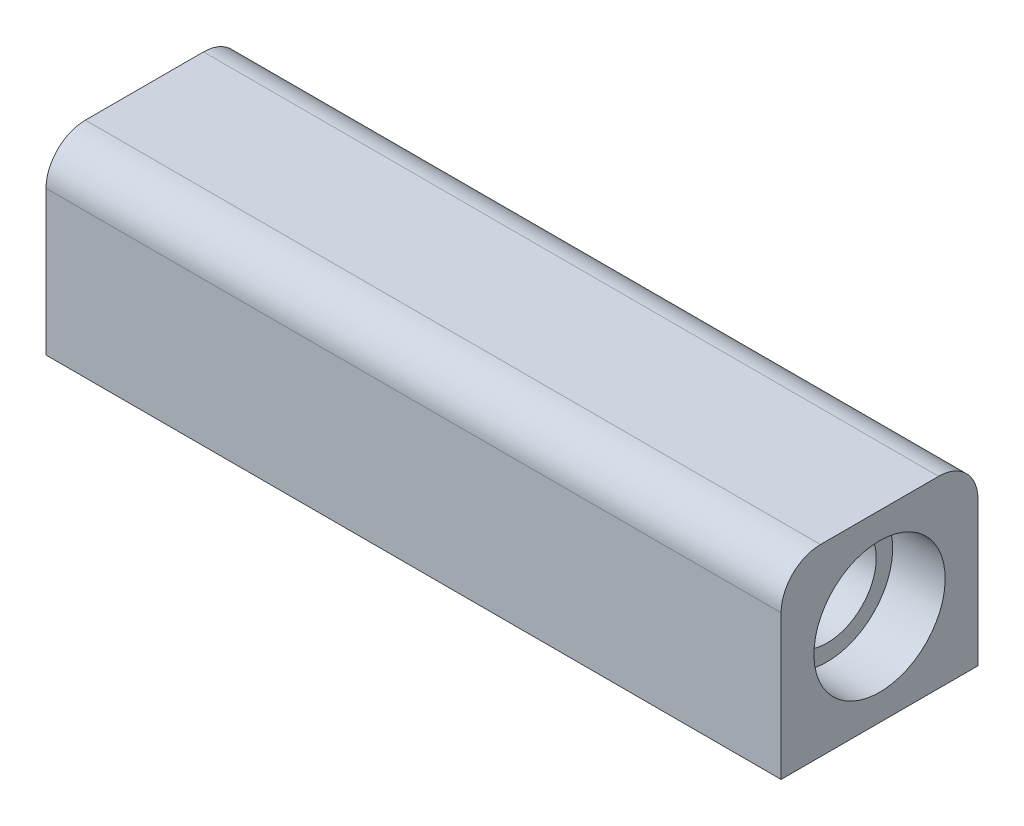
ISO-10303-21;
HEADER;
FILE_DESCRIPTION(('STEP AP214'),'2;1');
FILE_NAME('part.step','',(''),(''),'','','');
FILE_SCHEMA(('AUTOMOTIVE_DESIGN { 1 0 10303 214 1 1 1 1 }'));
ENDSEC;
DATA;
#1=APPLICATION_CONTEXT('core data for automotive mechanical design processes');
#2=APPLICATION_PROTOCOL_DEFINITION('international standard','automotive_design',2000,#1);
#3=PRODUCT_CONTEXT('',#1,'mechanical');
#4=PRODUCT('Part','Part','',(#3));
#5=PRODUCT_RELATED_PRODUCT_CATEGORY('part','',(#4));
#6=PRODUCT_DEFINITION_FORMATION('','',#4);
#7=PRODUCT_DEFINITION_CONTEXT('part definition',#1,'design');
#8=PRODUCT_DEFINITION('design','',#6,#7);
#9=PRODUCT_DEFINITION_SHAPE('','',#8);
#10=(LENGTH_UNIT() NAMED_UNIT(*) SI_UNIT(.MILLI.,.METRE.));
#11=(NAMED_UNIT(*) PLANE_ANGLE_UNIT() SI_UNIT($,.RADIAN.));
#12=(NAMED_UNIT(*) SI_UNIT($,.STERADIAN.) SOLID_ANGLE_UNIT());
#13=UNCERTAINTY_MEASURE_WITH_UNIT(LENGTH_MEASURE(1.E-05),#10,'distance_accuracy_value','');
#14=(GEOMETRIC_REPRESENTATION_CONTEXT(3) GLOBAL_UNCERTAINTY_ASSIGNED_CONTEXT((#13)) GLOBAL_UNIT_ASSIGNED_CONTEXT((#10,
#11,#12)) REPRESENTATION_CONTEXT('',''));
#15=CARTESIAN_POINT('',(0.,0.,0.));
#16=DIRECTION('',(0.,0.,1.));
#17=DIRECTION('',(1.,0.,0.));
#18=AXIS2_PLACEMENT_3D('',#15,#16,#17);
#19=CARTESIAN_POINT('',(28.,0.,7.5));
#20=DIRECTION('',(1.,0.,0.));
#21=DIRECTION('',(0.,0.,-1.));
#22=AXIS2_PLACEMENT_3D('',#19,#20,#21);
#23=CYLINDRICAL_SURFACE('',#22,3.74999999999999);
#24=CARTESIAN_POINT('',(24.,0.,7.5));
#25=DIRECTION('',(1.,0.,0.));
#26=DIRECTION('',(0.,1.,0.));
#27=AXIS2_PLACEMENT_3D('',#24,#25,#26);
#28=CIRCLE('',#27,3.74999999999999);
#29=CARTESIAN_POINT('',(24.,3.74999999999997,7.5));
#30=VERTEX_POINT('',#29);
#31=EDGE_CURVE('E125',#30,#30,#28,.F.);
#32=ORIENTED_EDGE('',*,*,#31,.F.);
#33=EDGE_LOOP('',(#32));
#34=FACE_BOUND('',#33,.T.);
#35=CARTESIAN_POINT('',(-24.,0.,7.5));
#36=DIRECTION('',(-1.,0.,0.));
#37=DIRECTION('',(0.,0.,1.));
#38=AXIS2_PLACEMENT_3D('',#35,#36,#37);
#39=CIRCLE('',#38,3.74999999999999);
#40=CARTESIAN_POINT('',(-24.,0.,11.25));
#41=VERTEX_POINT('',#40);
#42=EDGE_CURVE('E129',#41,#41,#39,.F.);
#43=ORIENTED_EDGE('',*,*,#42,.F.);
#44=EDGE_LOOP('',(#43));
#45=FACE_BOUND('',#44,.T.);
#46=ADVANCED_FACE('F39',(#34,#45),#23,.F.);
#47=CARTESIAN_POINT('',(-28.,7.,15.));
#48=DIRECTION('',(1.,0.,0.));
#49=DIRECTION('',(0.,1.,0.));
#50=AXIS2_PLACEMENT_3D('',#47,#48,#49);
#51=PLANE('',#50);
#52=CARTESIAN_POINT('',(-28.,0.,7.5));
#53=DIRECTION('',(-1.,0.,0.));
#54=DIRECTION('',(0.,0.,1.));
#55=AXIS2_PLACEMENT_3D('',#52,#53,#54);
#56=CIRCLE('',#55,5.);
#57=CARTESIAN_POINT('',(-28.,0.,12.5));
#58=VERTEX_POINT('',#57);
#59=EDGE_CURVE('E280',#58,#58,#56,.T.);
#60=ORIENTED_EDGE('',*,*,#59,.F.);
#61=EDGE_LOOP('',(#60));
#62=FACE_BOUND('',#61,.T.);
#63=DIRECTION('',(0.,0.,-1.));
#64=VECTOR('',#63,1.);
#65=CARTESIAN_POINT('',(-28.,7.,15.));
#66=LINE('',#65,#64);
#67=CARTESIAN_POINT('',(-28.,7.,12.));
#68=VERTEX_POINT('',#67);
#69=CARTESIAN_POINT('',(-28.,7.,3.));
#70=VERTEX_POINT('',#69);
#71=EDGE_CURVE('E150',#68,#70,#66,.T.);
#72=ORIENTED_EDGE('',*,*,#71,.T.);
#73=CARTESIAN_POINT('',(-28.,4.,3.));
#74=DIRECTION('',(1.,0.,0.));
#75=DIRECTION('',(0.,1.,0.));
#76=AXIS2_PLACEMENT_3D('',#73,#74,#75);
#77=CIRCLE('',#76,3.);
#78=CARTESIAN_POINT('',(-28.,4.,0.));
#79=VERTEX_POINT('',#78);
#80=EDGE_CURVE('E138',#70,#79,#77,.F.);
#81=ORIENTED_EDGE('',*,*,#80,.T.);
#82=DIRECTION('',(0.,-1.,0.));
#83=VECTOR('',#82,1.);
#84=CARTESIAN_POINT('',(-28.,7.,0.));
#85=LINE('',#84,#83);
#86=CARTESIAN_POINT('',(-28.,-7.,0.));
#87=VERTEX_POINT('',#86);
#88=EDGE_CURVE('E115',#79,#87,#85,.T.);
#89=ORIENTED_EDGE('',*,*,#88,.T.);
#90=DIRECTION('',(0.,0.,-1.));
#91=VECTOR('',#90,1.);
#92=CARTESIAN_POINT('',(-28.,-7.,15.));
#93=LINE('',#92,#91);
#94=CARTESIAN_POINT('',(-28.,-7.,15.));
#95=VERTEX_POINT('',#94);
#96=EDGE_CURVE('E108',#95,#87,#93,.T.);
#97=ORIENTED_EDGE('',*,*,#96,.F.);
#98=DIRECTION('',(0.,-1.,0.));
#99=VECTOR('',#98,1.);
#100=CARTESIAN_POINT('',(-28.,7.,15.));
#101=LINE('',#100,#99);
#102=CARTESIAN_POINT('',(-28.,4.,15.));
#103=VERTEX_POINT('',#102);
#104=EDGE_CURVE('E95',#103,#95,#101,.T.);
#105=ORIENTED_EDGE('',*,*,#104,.F.);
#106=CARTESIAN_POINT('',(-28.,4.,12.));
#107=DIRECTION('',(1.,0.,0.));
#108=DIRECTION('',(0.,1.,0.));
#109=AXIS2_PLACEMENT_3D('',#106,#107,#108);
#110=CIRCLE('',#109,3.);
#111=EDGE_CURVE('E136',#103,#68,#110,.F.);
#112=ORIENTED_EDGE('',*,*,#111,.T.);
#113=EDGE_LOOP('',(#72,#81,#89,#97,#105,#112));
#114=FACE_BOUND('',#113,.T.);
#115=ADVANCED_FACE('F114',(#62,#114),#51,.F.);
#116=CARTESIAN_POINT('',(28.,-7.,15.));
#117=DIRECTION('',(0.,1.,0.));
#118=DIRECTION('',(-1.,0.,0.));
#119=AXIS2_PLACEMENT_3D('',#116,#117,#118);
#120=PLANE('',#119);
#121=DIRECTION('',(1.,0.,0.));
#122=VECTOR('',#121,1.);
#123=CARTESIAN_POINT('',(28.,-7.,0.));
#124=LINE('',#123,#122);
#125=CARTESIAN_POINT('',(28.,-7.,0.));
#126=VERTEX_POINT('',#125);
#127=EDGE_CURVE('E153',#87,#126,#124,.T.);
#128=ORIENTED_EDGE('',*,*,#127,.T.);
#129=DIRECTION('',(0.,0.,-1.));
#130=VECTOR('',#129,1.);
#131=CARTESIAN_POINT('',(28.,-7.,15.));
#132=LINE('',#131,#130);
#133=CARTESIAN_POINT('',(28.,-7.,15.));
#134=VERTEX_POINT('',#133);
#135=EDGE_CURVE('E110',#134,#126,#132,.T.);
#136=ORIENTED_EDGE('',*,*,#135,.F.);
#137=DIRECTION('',(1.,0.,0.));
#138=VECTOR('',#137,1.);
#139=CARTESIAN_POINT('',(28.,-7.,15.));
#140=LINE('',#139,#138);
#141=EDGE_CURVE('E98',#95,#134,#140,.T.);
#142=ORIENTED_EDGE('',*,*,#141,.F.);
#143=ORIENTED_EDGE('',*,*,#96,.T.);
#144=EDGE_LOOP('',(#128,#136,#142,#143));
#145=FACE_BOUND('',#144,.T.);
#146=ADVANCED_FACE('F107',(#145),#120,.F.);
#147=CARTESIAN_POINT('',(28.,7.,15.));
#148=DIRECTION('',(-1.,0.,0.));
#149=DIRECTION('',(0.,-1.,0.));
#150=AXIS2_PLACEMENT_3D('',#147,#148,#149);
#151=PLANE('',#150);
#152=CARTESIAN_POINT('',(28.,0.,7.5));
#153=DIRECTION('',(1.,0.,0.));
#154=DIRECTION('',(0.,1.,0.));
#155=AXIS2_PLACEMENT_3D('',#152,#153,#154);
#156=CIRCLE('',#155,5.);
#157=CARTESIAN_POINT('',(28.,4.99999999999998,7.5));
#158=VERTEX_POINT('',#157);
#159=EDGE_CURVE('E131',#158,#158,#156,.T.);
#160=ORIENTED_EDGE('',*,*,#159,.F.);
#161=EDGE_LOOP('',(#160));
#162=FACE_BOUND('',#161,.T.);
#163=DIRECTION('',(0.,1.,0.));
#164=VECTOR('',#163,1.);
#165=CARTESIAN_POINT('',(28.,7.,0.));
#166=LINE('',#165,#164);
#167=CARTESIAN_POINT('',(28.,4.,0.));
#168=VERTEX_POINT('',#167);
#169=EDGE_CURVE('E103',#126,#168,#166,.T.);
#170=ORIENTED_EDGE('',*,*,#169,.T.);
#171=CARTESIAN_POINT('',(28.,4.,3.));
#172=DIRECTION('',(-1.,0.,0.));
#173=DIRECTION('',(0.,-1.,0.));
#174=AXIS2_PLACEMENT_3D('',#171,#172,#173);
#175=CIRCLE('',#174,3.);
#176=CARTESIAN_POINT('',(28.,7.,3.));
#177=VERTEX_POINT('',#176);
#178=EDGE_CURVE('E47',#168,#177,#175,.F.);
#179=ORIENTED_EDGE('',*,*,#178,.T.);
#180=DIRECTION('',(0.,0.,-1.));
#181=VECTOR('',#180,1.);
#182=CARTESIAN_POINT('',(28.,7.,15.));
#183=LINE('',#182,#181);
#184=CARTESIAN_POINT('',(28.,7.,12.));
#185=VERTEX_POINT('',#184);
#186=EDGE_CURVE('E121',#185,#177,#183,.T.);
#187=ORIENTED_EDGE('',*,*,#186,.F.);
#188=CARTESIAN_POINT('',(28.,4.,12.));
#189=DIRECTION('',(-1.,0.,0.));
#190=DIRECTION('',(0.,-1.,0.));
#191=AXIS2_PLACEMENT_3D('',#188,#189,#190);
#192=CIRCLE('',#191,3.);
#193=CARTESIAN_POINT('',(28.,4.,15.));
#194=VERTEX_POINT('',#193);
#195=EDGE_CURVE('E54',#185,#194,#192,.F.);
#196=ORIENTED_EDGE('',*,*,#195,.T.);
#197=DIRECTION('',(0.,1.,0.));
#198=VECTOR('',#197,1.);
#199=CARTESIAN_POINT('',(28.,7.,15.));
#200=LINE('',#199,#198);
#201=EDGE_CURVE('E111',#134,#194,#200,.T.);
#202=ORIENTED_EDGE('',*,*,#201,.F.);
#203=ORIENTED_EDGE('',*,*,#135,.T.);
#204=EDGE_LOOP('',(#170,#179,#187,#196,#202,#203));
#205=FACE_BOUND('',#204,.T.);
#206=ADVANCED_FACE('F143',(#162,#205),#151,.F.);
#207=CARTESIAN_POINT('',(28.,7.,15.));
#208=DIRECTION('',(0.,-1.,0.));
#209=DIRECTION('',(1.,0.,0.));
#210=AXIS2_PLACEMENT_3D('',#207,#208,#209);
#211=PLANE('',#210);
#212=ORIENTED_EDGE('',*,*,#186,.T.);
#213=DIRECTION('',(-1.,0.,0.));
#214=VECTOR('',#213,1.);
#215=CARTESIAN_POINT('',(-28.,7.,3.));
#216=LINE('',#215,#214);
#217=EDGE_CURVE('E119',#177,#70,#216,.T.);
#218=ORIENTED_EDGE('',*,*,#217,.T.);
#219=ORIENTED_EDGE('',*,*,#71,.F.);
#220=DIRECTION('',(-1.,0.,0.));
#221=VECTOR('',#220,1.);
#222=CARTESIAN_POINT('',(28.,7.,12.));
#223=LINE('',#222,#221);
#224=EDGE_CURVE('E117',#68,#185,#223,.F.);
#225=ORIENTED_EDGE('',*,*,#224,.T.);
#226=EDGE_LOOP('',(#212,#218,#219,#225));
#227=FACE_BOUND('',#226,.T.);
#228=ADVANCED_FACE('F147',(#227),#211,.F.);
#229=CARTESIAN_POINT('',(0.,0.,15.));
#230=DIRECTION('',(0.,0.,-1.));
#231=DIRECTION('',(-1.,0.,0.));
#232=AXIS2_PLACEMENT_3D('',#229,#230,#231);
#233=PLANE('',#232);
#234=ORIENTED_EDGE('',*,*,#201,.T.);
#235=DIRECTION('',(-1.,0.,0.));
#236=VECTOR('',#235,1.);
#237=CARTESIAN_POINT('',(0.,4.,15.));
#238=LINE('',#237,#236);
#239=EDGE_CURVE('E11',#194,#103,#238,.T.);
#240=ORIENTED_EDGE('',*,*,#239,.T.);
#241=ORIENTED_EDGE('',*,*,#104,.T.);
#242=ORIENTED_EDGE('',*,*,#141,.T.);
#243=EDGE_LOOP('',(#234,#240,#241,#242));
#244=FACE_BOUND('',#243,.T.);
#245=ADVANCED_FACE('F97',(#244),#233,.F.);
#246=CARTESIAN_POINT('',(0.,0.,0.));
#247=DIRECTION('',(0.,0.,-1.));
#248=DIRECTION('',(-1.,0.,0.));
#249=AXIS2_PLACEMENT_3D('',#246,#247,#248);
#250=PLANE('',#249);
#251=ORIENTED_EDGE('',*,*,#88,.F.);
#252=DIRECTION('',(-1.,0.,0.));
#253=VECTOR('',#252,1.);
#254=CARTESIAN_POINT('',(28.,4.,0.));
#255=LINE('',#254,#253);
#256=EDGE_CURVE('E62',#79,#168,#255,.F.);
#257=ORIENTED_EDGE('',*,*,#256,.T.);
#258=ORIENTED_EDGE('',*,*,#169,.F.);
#259=ORIENTED_EDGE('',*,*,#127,.F.);
#260=EDGE_LOOP('',(#251,#257,#258,#259));
#261=FACE_BOUND('',#260,.T.);
#262=ADVANCED_FACE('F152',(#261),#250,.T.);
#263=CARTESIAN_POINT('',(24.,0.,7.5));
#264=DIRECTION('',(1.,0.,0.));
#265=DIRECTION('',(0.,1.,0.));
#266=AXIS2_PLACEMENT_3D('',#263,#264,#265);
#267=PLANE('',#266);
#268=CARTESIAN_POINT('',(24.,0.,7.5));
#269=DIRECTION('',(1.,0.,0.));
#270=DIRECTION('',(0.,1.,0.));
#271=AXIS2_PLACEMENT_3D('',#268,#269,#270);
#272=CIRCLE('',#271,5.);
#273=CARTESIAN_POINT('',(24.,4.99999999999998,7.5));
#274=VERTEX_POINT('',#273);
#275=EDGE_CURVE('E128',#274,#274,#272,.T.);
#276=ORIENTED_EDGE('',*,*,#275,.T.);
#277=EDGE_LOOP('',(#276));
#278=FACE_BOUND('',#277,.T.);
#279=ORIENTED_EDGE('',*,*,#31,.T.);
#280=EDGE_LOOP('',(#279));
#281=FACE_BOUND('',#280,.T.);
#282=ADVANCED_FACE('F183',(#278,#281),#267,.T.);
#283=CARTESIAN_POINT('',(24.,0.,7.5));
#284=DIRECTION('',(1.,0.,0.));
#285=DIRECTION('',(0.,1.,0.));
#286=AXIS2_PLACEMENT_3D('',#283,#284,#285);
#287=CYLINDRICAL_SURFACE('',#286,5.);
#288=ORIENTED_EDGE('',*,*,#275,.F.);
#289=EDGE_LOOP('',(#288));
#290=FACE_BOUND('',#289,.T.);
#291=ORIENTED_EDGE('',*,*,#159,.T.);
#292=EDGE_LOOP('',(#291));
#293=FACE_BOUND('',#292,.T.);
#294=ADVANCED_FACE('F177',(#290,#293),#287,.F.);
#295=CARTESIAN_POINT('',(-24.,0.,7.5));
#296=DIRECTION('',(-1.,0.,0.));
#297=DIRECTION('',(0.,0.,1.));
#298=AXIS2_PLACEMENT_3D('',#295,#296,#297);
#299=PLANE('',#298);
#300=CARTESIAN_POINT('',(-24.,0.,7.5));
#301=DIRECTION('',(-1.,0.,0.));
#302=DIRECTION('',(0.,0.,1.));
#303=AXIS2_PLACEMENT_3D('',#300,#301,#302);
#304=CIRCLE('',#303,5.);
#305=CARTESIAN_POINT('',(-24.,0.,12.5));
#306=VERTEX_POINT('',#305);
#307=EDGE_CURVE('E132',#306,#306,#304,.T.);
#308=ORIENTED_EDGE('',*,*,#307,.T.);
#309=EDGE_LOOP('',(#308));
#310=FACE_BOUND('',#309,.T.);
#311=ORIENTED_EDGE('',*,*,#42,.T.);
#312=EDGE_LOOP('',(#311));
#313=FACE_BOUND('',#312,.T.);
#314=ADVANCED_FACE('F223',(#310,#313),#299,.T.);
#315=CARTESIAN_POINT('',(-24.,0.,7.5));
#316=DIRECTION('',(-1.,0.,0.));
#317=DIRECTION('',(0.,0.,1.));
#318=AXIS2_PLACEMENT_3D('',#315,#316,#317);
#319=CYLINDRICAL_SURFACE('',#318,5.);
#320=ORIENTED_EDGE('',*,*,#307,.F.);
#321=EDGE_LOOP('',(#320));
#322=FACE_BOUND('',#321,.T.);
#323=ORIENTED_EDGE('',*,*,#59,.T.);
#324=EDGE_LOOP('',(#323));
#325=FACE_BOUND('',#324,.T.);
#326=ADVANCED_FACE('F164',(#322,#325),#319,.F.);
#327=CARTESIAN_POINT('',(28.,4.,3.));
#328=DIRECTION('',(1.,0.,0.));
#329=DIRECTION('',(0.,1.,0.));
#330=AXIS2_PLACEMENT_3D('',#327,#328,#329);
#331=CYLINDRICAL_SURFACE('',#330,3.);
#332=ORIENTED_EDGE('',*,*,#178,.F.);
#333=ORIENTED_EDGE('',*,*,#256,.F.);
#334=ORIENTED_EDGE('',*,*,#80,.F.);
#335=ORIENTED_EDGE('',*,*,#217,.F.);
#336=EDGE_LOOP('',(#332,#333,#334,#335));
#337=FACE_BOUND('',#336,.T.);
#338=ADVANCED_FACE('F151',(#337),#331,.T.);
#339=CARTESIAN_POINT('',(0.,4.,12.));
#340=DIRECTION('',(-1.,0.,0.));
#341=DIRECTION('',(0.,-1.,0.));
#342=AXIS2_PLACEMENT_3D('',#339,#340,#341);
#343=CYLINDRICAL_SURFACE('',#342,3.);
#344=ORIENTED_EDGE('',*,*,#195,.F.);
#345=ORIENTED_EDGE('',*,*,#224,.F.);
#346=ORIENTED_EDGE('',*,*,#111,.F.);
#347=ORIENTED_EDGE('',*,*,#239,.F.);
#348=EDGE_LOOP('',(#344,#345,#346,#347));
#349=FACE_BOUND('',#348,.T.);
#350=ADVANCED_FACE('F41',(#349),#343,.T.);
#351=CLOSED_SHELL('',(#46,#115,#146,#206,#228,#245,#262,#282,#294,#314,#326,#338,#350));
#352=MANIFOLD_SOLID_BREP('B2',#351);
#353=ADVANCED_BREP_SHAPE_REPRESENTATION('',(#18,#352),#14);
#354=SHAPE_DEFINITION_REPRESENTATION(#9,#353);
ENDSEC;
END-ISO-10303-21;
